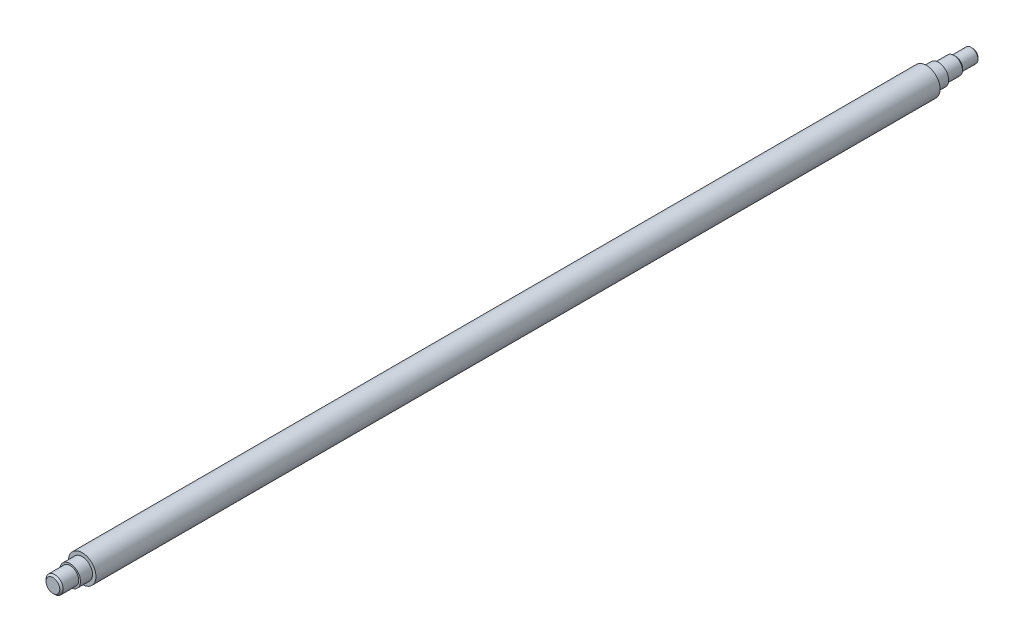
ISO-10303-21;
HEADER;
FILE_DESCRIPTION(('STEP AP214'),'2;1');
FILE_NAME('part.step','',(''),(''),'','','');
FILE_SCHEMA(('AUTOMOTIVE_DESIGN { 1 0 10303 214 1 1 1 1 }'));
ENDSEC;
DATA;
#1=APPLICATION_CONTEXT('core data for automotive mechanical design processes');
#2=APPLICATION_PROTOCOL_DEFINITION('international standard','automotive_design',2000,#1);
#3=PRODUCT_CONTEXT('',#1,'mechanical');
#4=PRODUCT('Part','Part','',(#3));
#5=PRODUCT_RELATED_PRODUCT_CATEGORY('part','',(#4));
#6=PRODUCT_DEFINITION_FORMATION('','',#4);
#7=PRODUCT_DEFINITION_CONTEXT('part definition',#1,'design');
#8=PRODUCT_DEFINITION('design','',#6,#7);
#9=PRODUCT_DEFINITION_SHAPE('','',#8);
#10=(LENGTH_UNIT() NAMED_UNIT(*) SI_UNIT(.MILLI.,.METRE.));
#11=(NAMED_UNIT(*) PLANE_ANGLE_UNIT() SI_UNIT($,.RADIAN.));
#12=(NAMED_UNIT(*) SI_UNIT($,.STERADIAN.) SOLID_ANGLE_UNIT());
#13=UNCERTAINTY_MEASURE_WITH_UNIT(LENGTH_MEASURE(1.E-05),#10,'distance_accuracy_value','');
#14=(GEOMETRIC_REPRESENTATION_CONTEXT(3) GLOBAL_UNCERTAINTY_ASSIGNED_CONTEXT((#13)) GLOBAL_UNIT_ASSIGNED_CONTEXT((#10,
#11,#12)) REPRESENTATION_CONTEXT('',''));
#15=CARTESIAN_POINT('',(0.,0.,0.));
#16=DIRECTION('',(0.,0.,1.));
#17=DIRECTION('',(1.,0.,0.));
#18=AXIS2_PLACEMENT_3D('',#15,#16,#17);
#19=CARTESIAN_POINT('',(0.,0.,497.));
#20=DIRECTION('',(0.,0.,1.));
#21=DIRECTION('',(1.,0.,0.));
#22=AXIS2_PLACEMENT_3D('',#19,#20,#21);
#23=PLANE('',#22);
#24=CARTESIAN_POINT('',(0.,0.,497.));
#25=DIRECTION('',(0.,0.,1.));
#26=DIRECTION('',(1.,0.,0.));
#27=AXIS2_PLACEMENT_3D('',#24,#25,#26);
#28=CIRCLE('',#27,6.);
#29=CARTESIAN_POINT('',(6.,0.,497.));
#30=VERTEX_POINT('',#29);
#31=EDGE_CURVE('E74',#30,#30,#28,.T.);
#32=ORIENTED_EDGE('',*,*,#31,.T.);
#33=EDGE_LOOP('',(#32));
#34=FACE_BOUND('',#33,.T.);
#35=CARTESIAN_POINT('',(0.,0.,497.));
#36=DIRECTION('',(0.,0.,1.));
#37=DIRECTION('',(1.,0.,0.));
#38=AXIS2_PLACEMENT_3D('',#35,#36,#37);
#39=CIRCLE('',#38,5.);
#40=CARTESIAN_POINT('',(5.,0.,497.));
#41=VERTEX_POINT('',#40);
#42=EDGE_CURVE('E77',#41,#41,#39,.T.);
#43=ORIENTED_EDGE('',*,*,#42,.F.);
#44=EDGE_LOOP('',(#43));
#45=FACE_BOUND('',#44,.T.);
#46=ADVANCED_FACE('F30',(#34,#45),#23,.T.);
#47=CARTESIAN_POINT('',(0.,0.,490.));
#48=DIRECTION('',(0.,0.,1.));
#49=DIRECTION('',(1.,0.,0.));
#50=AXIS2_PLACEMENT_3D('',#47,#48,#49);
#51=PLANE('',#50);
#52=CARTESIAN_POINT('',(0.,0.,490.));
#53=DIRECTION('',(0.,0.,1.));
#54=DIRECTION('',(1.,0.,0.));
#55=AXIS2_PLACEMENT_3D('',#52,#53,#54);
#56=CIRCLE('',#55,8.);
#57=CARTESIAN_POINT('',(8.,0.,490.));
#58=VERTEX_POINT('',#57);
#59=EDGE_CURVE('E56',#58,#58,#56,.T.);
#60=ORIENTED_EDGE('',*,*,#59,.T.);
#61=EDGE_LOOP('',(#60));
#62=FACE_BOUND('',#61,.T.);
#63=CARTESIAN_POINT('',(0.,0.,490.));
#64=DIRECTION('',(0.,0.,1.));
#65=DIRECTION('',(1.,0.,0.));
#66=AXIS2_PLACEMENT_3D('',#63,#64,#65);
#67=CIRCLE('',#66,6.);
#68=CARTESIAN_POINT('',(6.,0.,490.));
#69=VERTEX_POINT('',#68);
#70=EDGE_CURVE('E71',#69,#69,#67,.T.);
#71=ORIENTED_EDGE('',*,*,#70,.F.);
#72=EDGE_LOOP('',(#71));
#73=FACE_BOUND('',#72,.T.);
#74=ADVANCED_FACE('F84',(#62,#73),#51,.T.);
#75=CARTESIAN_POINT('',(0.,0.,-7.));
#76=DIRECTION('',(0.,0.,-1.));
#77=DIRECTION('',(-1.,0.,0.));
#78=AXIS2_PLACEMENT_3D('',#75,#76,#77);
#79=PLANE('',#78);
#80=CARTESIAN_POINT('',(0.,0.,-7.));
#81=DIRECTION('',(0.,0.,-1.));
#82=DIRECTION('',(-1.,0.,0.));
#83=AXIS2_PLACEMENT_3D('',#80,#81,#82);
#84=CIRCLE('',#83,6.);
#85=CARTESIAN_POINT('',(-6.,0.,-7.));
#86=VERTEX_POINT('',#85);
#87=EDGE_CURVE('E60',#86,#86,#84,.T.);
#88=ORIENTED_EDGE('',*,*,#87,.T.);
#89=EDGE_LOOP('',(#88));
#90=FACE_BOUND('',#89,.T.);
#91=CARTESIAN_POINT('',(0.,0.,-7.));
#92=DIRECTION('',(0.,0.,-1.));
#93=DIRECTION('',(-1.,0.,0.));
#94=AXIS2_PLACEMENT_3D('',#91,#92,#93);
#95=CIRCLE('',#94,5.);
#96=CARTESIAN_POINT('',(-5.,0.,-7.));
#97=VERTEX_POINT('',#96);
#98=EDGE_CURVE('E65',#97,#97,#95,.T.);
#99=ORIENTED_EDGE('',*,*,#98,.F.);
#100=EDGE_LOOP('',(#99));
#101=FACE_BOUND('',#100,.T.);
#102=ADVANCED_FACE('F90',(#90,#101),#79,.T.);
#103=CARTESIAN_POINT('',(0.,0.,0.));
#104=DIRECTION('',(0.,0.,1.));
#105=DIRECTION('',(1.,0.,0.));
#106=AXIS2_PLACEMENT_3D('',#103,#104,#105);
#107=PLANE('',#106);
#108=CARTESIAN_POINT('',(0.,0.,0.));
#109=DIRECTION('',(0.,0.,1.));
#110=DIRECTION('',(1.,0.,0.));
#111=AXIS2_PLACEMENT_3D('',#108,#109,#110);
#112=CIRCLE('',#111,8.);
#113=CARTESIAN_POINT('',(8.,0.,0.));
#114=VERTEX_POINT('',#113);
#115=EDGE_CURVE('E57',#114,#114,#112,.T.);
#116=ORIENTED_EDGE('',*,*,#115,.F.);
#117=EDGE_LOOP('',(#116));
#118=FACE_BOUND('',#117,.T.);
#119=CARTESIAN_POINT('',(0.,0.,0.));
#120=DIRECTION('',(0.,0.,1.));
#121=DIRECTION('',(1.,0.,0.));
#122=AXIS2_PLACEMENT_3D('',#119,#120,#121);
#123=CIRCLE('',#122,6.);
#124=CARTESIAN_POINT('',(6.,0.,0.));
#125=VERTEX_POINT('',#124);
#126=EDGE_CURVE('E53',#125,#125,#123,.F.);
#127=ORIENTED_EDGE('',*,*,#126,.F.);
#128=EDGE_LOOP('',(#127));
#129=FACE_BOUND('',#128,.T.);
#130=ADVANCED_FACE('F117',(#118,#129),#107,.F.);
#131=CARTESIAN_POINT('',(0.,0.,490.));
#132=DIRECTION('',(0.,0.,-1.));
#133=DIRECTION('',(-1.,0.,0.));
#134=AXIS2_PLACEMENT_3D('',#131,#132,#133);
#135=CYLINDRICAL_SURFACE('',#134,8.);
#136=ORIENTED_EDGE('',*,*,#59,.F.);
#137=EDGE_LOOP('',(#136));
#138=FACE_BOUND('',#137,.T.);
#139=ORIENTED_EDGE('',*,*,#115,.T.);
#140=EDGE_LOOP('',(#139));
#141=FACE_BOUND('',#140,.T.);
#142=ADVANCED_FACE('F120',(#138,#141),#135,.T.);
#143=CARTESIAN_POINT('',(0.,0.,-5.));
#144=DIRECTION('',(0.,0.,1.));
#145=DIRECTION('',(1.,0.,0.));
#146=AXIS2_PLACEMENT_3D('',#143,#144,#145);
#147=CYLINDRICAL_SURFACE('',#146,6.);
#148=ORIENTED_EDGE('',*,*,#126,.T.);
#149=EDGE_LOOP('',(#148));
#150=FACE_BOUND('',#149,.T.);
#151=ORIENTED_EDGE('',*,*,#87,.F.);
#152=EDGE_LOOP('',(#151));
#153=FACE_BOUND('',#152,.T.);
#154=ADVANCED_FACE('F113',(#150,#153),#147,.T.);
#155=CARTESIAN_POINT('',(0.,0.,-17.));
#156=DIRECTION('',(0.,0.,1.));
#157=DIRECTION('',(1.,0.,0.));
#158=AXIS2_PLACEMENT_3D('',#155,#156,#157);
#159=CYLINDRICAL_SURFACE('',#158,5.);
#160=CARTESIAN_POINT('',(0.,0.,-16.));
#161=DIRECTION('',(0.,0.,-1.));
#162=DIRECTION('',(-1.,0.,0.));
#163=AXIS2_PLACEMENT_3D('',#160,#161,#162);
#164=CIRCLE('',#163,5.);
#165=CARTESIAN_POINT('',(-5.,0.,-16.));
#166=VERTEX_POINT('',#165);
#167=EDGE_CURVE('E50',#166,#166,#164,.F.);
#168=ORIENTED_EDGE('',*,*,#167,.T.);
#169=EDGE_LOOP('',(#168));
#170=FACE_BOUND('',#169,.T.);
#171=ORIENTED_EDGE('',*,*,#98,.T.);
#172=EDGE_LOOP('',(#171));
#173=FACE_BOUND('',#172,.T.);
#174=ADVANCED_FACE('F109',(#170,#173),#159,.T.);
#175=CARTESIAN_POINT('',(0.,0.,-27.));
#176=DIRECTION('',(0.,0.,1.));
#177=DIRECTION('',(1.,0.,0.));
#178=AXIS2_PLACEMENT_3D('',#175,#176,#177);
#179=CYLINDRICAL_SURFACE('',#178,4.);
#180=CARTESIAN_POINT('',(0.,0.,-26.));
#181=DIRECTION('',(0.,0.,-1.));
#182=DIRECTION('',(-1.,0.,0.));
#183=AXIS2_PLACEMENT_3D('',#180,#181,#182);
#184=CIRCLE('',#183,4.);
#185=CARTESIAN_POINT('',(-4.,0.,-26.));
#186=VERTEX_POINT('',#185);
#187=EDGE_CURVE('E41',#186,#186,#184,.F.);
#188=ORIENTED_EDGE('',*,*,#187,.T.);
#189=EDGE_LOOP('',(#188));
#190=FACE_BOUND('',#189,.T.);
#191=CARTESIAN_POINT('',(0.,0.,-17.));
#192=DIRECTION('',(0.,0.,-1.));
#193=DIRECTION('',(-1.,0.,0.));
#194=AXIS2_PLACEMENT_3D('',#191,#192,#193);
#195=CIRCLE('',#194,4.);
#196=CARTESIAN_POINT('',(-4.,0.,-17.));
#197=VERTEX_POINT('',#196);
#198=EDGE_CURVE('E68',#197,#197,#195,.T.);
#199=ORIENTED_EDGE('',*,*,#198,.T.);
#200=EDGE_LOOP('',(#199));
#201=FACE_BOUND('',#200,.T.);
#202=ADVANCED_FACE('F105',(#190,#201),#179,.T.);
#203=CARTESIAN_POINT('',(0.,0.,-27.));
#204=DIRECTION('',(0.,0.,-1.));
#205=DIRECTION('',(-1.,0.,0.));
#206=AXIS2_PLACEMENT_3D('',#203,#204,#205);
#207=PLANE('',#206);
#208=CARTESIAN_POINT('',(0.,0.,-27.));
#209=DIRECTION('',(0.,0.,-1.));
#210=DIRECTION('',(-1.,0.,0.));
#211=AXIS2_PLACEMENT_3D('',#208,#209,#210);
#212=CIRCLE('',#211,2.99999999999995);
#213=CARTESIAN_POINT('',(-2.99999999999995,0.,-27.));
#214=VERTEX_POINT('',#213);
#215=EDGE_CURVE('E45',#214,#214,#212,.T.);
#216=ORIENTED_EDGE('',*,*,#215,.T.);
#217=EDGE_LOOP('',(#216));
#218=FACE_BOUND('',#217,.T.);
#219=ADVANCED_FACE('F101',(#218),#207,.T.);
#220=CARTESIAN_POINT('',(0.,0.,-17.));
#221=DIRECTION('',(0.,0.,1.));
#222=DIRECTION('',(1.,0.,0.));
#223=AXIS2_PLACEMENT_3D('',#220,#221,#222);
#224=CONICAL_SURFACE('',#223,3.99999999999995,0.785398163397467);
#225=ORIENTED_EDGE('',*,*,#167,.F.);
#226=EDGE_LOOP('',(#225));
#227=FACE_BOUND('',#226,.T.);
#228=ORIENTED_EDGE('',*,*,#198,.F.);
#229=EDGE_LOOP('',(#228));
#230=FACE_BOUND('',#229,.T.);
#231=ADVANCED_FACE('F104',(#227,#230),#224,.T.);
#232=CARTESIAN_POINT('',(0.,0.,-27.));
#233=DIRECTION('',(0.,0.,1.));
#234=DIRECTION('',(1.,0.,0.));
#235=AXIS2_PLACEMENT_3D('',#232,#233,#234);
#236=CONICAL_SURFACE('',#235,2.99999999999995,0.785398163397469);
#237=ORIENTED_EDGE('',*,*,#187,.F.);
#238=EDGE_LOOP('',(#237));
#239=FACE_BOUND('',#238,.T.);
#240=ORIENTED_EDGE('',*,*,#215,.F.);
#241=EDGE_LOOP('',(#240));
#242=FACE_BOUND('',#241,.T.);
#243=ADVANCED_FACE('F99',(#239,#242),#236,.T.);
#244=CARTESIAN_POINT('',(0.,0.,495.));
#245=DIRECTION('',(0.,0.,-1.));
#246=DIRECTION('',(-1.,0.,0.));
#247=AXIS2_PLACEMENT_3D('',#244,#245,#246);
#248=CYLINDRICAL_SURFACE('',#247,6.);
#249=ORIENTED_EDGE('',*,*,#70,.T.);
#250=EDGE_LOOP('',(#249));
#251=FACE_BOUND('',#250,.T.);
#252=ORIENTED_EDGE('',*,*,#31,.F.);
#253=EDGE_LOOP('',(#252));
#254=FACE_BOUND('',#253,.T.);
#255=ADVANCED_FACE('F96',(#251,#254),#248,.T.);
#256=CARTESIAN_POINT('',(0.,0.,507.));
#257=DIRECTION('',(0.,0.,-1.));
#258=DIRECTION('',(-1.,0.,0.));
#259=AXIS2_PLACEMENT_3D('',#256,#257,#258);
#260=CYLINDRICAL_SURFACE('',#259,5.);
#261=CARTESIAN_POINT('',(0.,0.,506.));
#262=DIRECTION('',(0.,0.,1.));
#263=DIRECTION('',(1.,0.,0.));
#264=AXIS2_PLACEMENT_3D('',#261,#262,#263);
#265=CIRCLE('',#264,5.);
#266=CARTESIAN_POINT('',(5.,0.,506.));
#267=VERTEX_POINT('',#266);
#268=EDGE_CURVE('E10',#267,#267,#265,.F.);
#269=ORIENTED_EDGE('',*,*,#268,.T.);
#270=EDGE_LOOP('',(#269));
#271=FACE_BOUND('',#270,.T.);
#272=ORIENTED_EDGE('',*,*,#42,.T.);
#273=EDGE_LOOP('',(#272));
#274=FACE_BOUND('',#273,.T.);
#275=ADVANCED_FACE('F81',(#271,#274),#260,.T.);
#276=CARTESIAN_POINT('',(0.,0.,507.));
#277=DIRECTION('',(0.,0.,1.));
#278=DIRECTION('',(1.,0.,0.));
#279=AXIS2_PLACEMENT_3D('',#276,#277,#278);
#280=PLANE('',#279);
#281=CARTESIAN_POINT('',(0.,0.,507.));
#282=DIRECTION('',(0.,0.,1.));
#283=DIRECTION('',(1.,0.,0.));
#284=AXIS2_PLACEMENT_3D('',#281,#282,#283);
#285=CIRCLE('',#284,3.99999999999995);
#286=CARTESIAN_POINT('',(3.99999999999995,0.,507.));
#287=VERTEX_POINT('',#286);
#288=EDGE_CURVE('E37',#287,#287,#285,.T.);
#289=ORIENTED_EDGE('',*,*,#288,.T.);
#290=EDGE_LOOP('',(#289));
#291=FACE_BOUND('',#290,.T.);
#292=ADVANCED_FACE('F155',(#291),#280,.T.);
#293=CARTESIAN_POINT('',(0.,0.,507.));
#294=DIRECTION('',(0.,0.,-1.));
#295=DIRECTION('',(-1.,0.,0.));
#296=AXIS2_PLACEMENT_3D('',#293,#294,#295);
#297=CONICAL_SURFACE('',#296,3.99999999999995,0.785398163397474);
#298=ORIENTED_EDGE('',*,*,#268,.F.);
#299=EDGE_LOOP('',(#298));
#300=FACE_BOUND('',#299,.T.);
#301=ORIENTED_EDGE('',*,*,#288,.F.);
#302=EDGE_LOOP('',(#301));
#303=FACE_BOUND('',#302,.T.);
#304=ADVANCED_FACE('F32',(#300,#303),#297,.T.);
#305=CLOSED_SHELL('',(#46,#74,#102,#130,#142,#154,#174,#202,#219,#231,#243,#255,#275,#292,#304));
#306=MANIFOLD_SOLID_BREP('B2',#305);
#307=ADVANCED_BREP_SHAPE_REPRESENTATION('',(#18,#306),#14);
#308=SHAPE_DEFINITION_REPRESENTATION(#9,#307);
ENDSEC;
END-ISO-10303-21;
